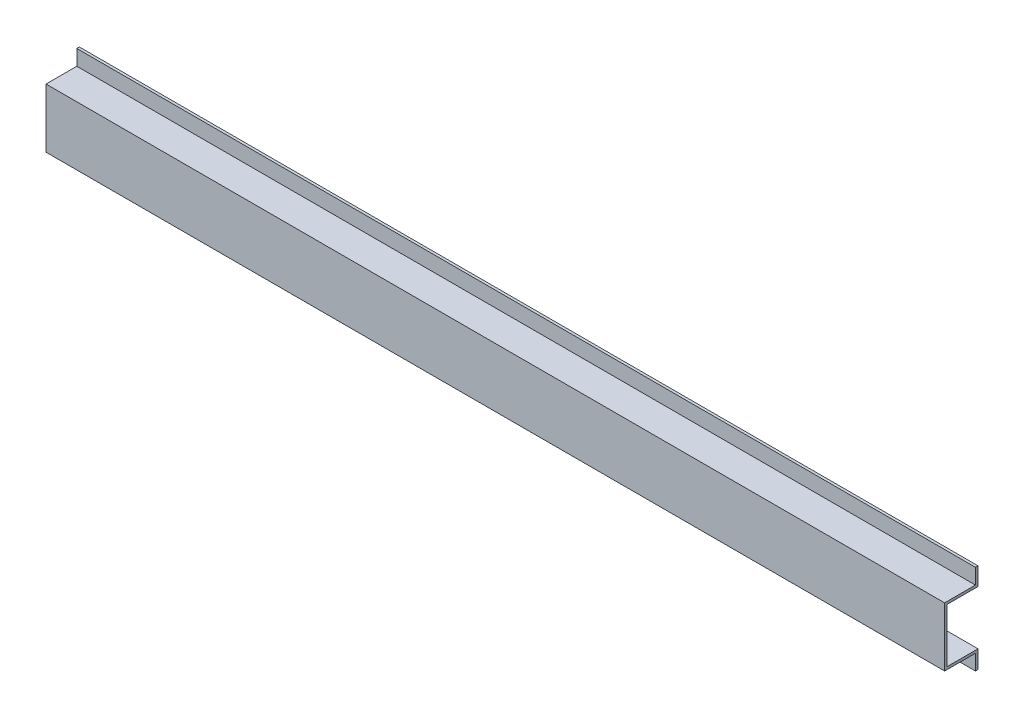
ISO-10303-21;
HEADER;
FILE_DESCRIPTION(('STEP AP214'),'2;1');
FILE_NAME('part.step','',(''),(''),'','','');
FILE_SCHEMA(('AUTOMOTIVE_DESIGN { 1 0 10303 214 1 1 1 1 }'));
ENDSEC;
DATA;
#1=APPLICATION_CONTEXT('core data for automotive mechanical design processes');
#2=APPLICATION_PROTOCOL_DEFINITION('international standard','automotive_design',2000,#1);
#3=PRODUCT_CONTEXT('',#1,'mechanical');
#4=PRODUCT('Part','Part','',(#3));
#5=PRODUCT_RELATED_PRODUCT_CATEGORY('part','',(#4));
#6=PRODUCT_DEFINITION_FORMATION('','',#4);
#7=PRODUCT_DEFINITION_CONTEXT('part definition',#1,'design');
#8=PRODUCT_DEFINITION('design','',#6,#7);
#9=PRODUCT_DEFINITION_SHAPE('','',#8);
#10=(LENGTH_UNIT() NAMED_UNIT(*) SI_UNIT(.MILLI.,.METRE.));
#11=(NAMED_UNIT(*) PLANE_ANGLE_UNIT() SI_UNIT($,.RADIAN.));
#12=(NAMED_UNIT(*) SI_UNIT($,.STERADIAN.) SOLID_ANGLE_UNIT());
#13=UNCERTAINTY_MEASURE_WITH_UNIT(LENGTH_MEASURE(1.E-05),#10,'distance_accuracy_value','');
#14=(GEOMETRIC_REPRESENTATION_CONTEXT(3) GLOBAL_UNCERTAINTY_ASSIGNED_CONTEXT((#13)) GLOBAL_UNIT_ASSIGNED_CONTEXT((#10,
#11,#12)) REPRESENTATION_CONTEXT('',''));
#15=CARTESIAN_POINT('',(0.,0.,0.));
#16=DIRECTION('',(0.,0.,1.));
#17=DIRECTION('',(1.,0.,0.));
#18=AXIS2_PLACEMENT_3D('',#15,#16,#17);
#19=CARTESIAN_POINT('',(350.,0.,0.));
#20=DIRECTION('',(0.,-1.,0.));
#21=DIRECTION('',(0.,0.,-1.));
#22=AXIS2_PLACEMENT_3D('',#19,#20,#21);
#23=PLANE('',#22);
#24=DIRECTION('',(0.,0.,1.));
#25=VECTOR('',#24,1.);
#26=CARTESIAN_POINT('',(0.,0.,0.));
#27=LINE('',#26,#25);
#28=CARTESIAN_POINT('',(0.,0.,0.));
#29=VERTEX_POINT('',#28);
#30=CARTESIAN_POINT('',(0.,0.,1.));
#31=VERTEX_POINT('',#30);
#32=EDGE_CURVE('E153',#29,#31,#27,.T.);
#33=ORIENTED_EDGE('',*,*,#32,.T.);
#34=DIRECTION('',(-1.,0.,0.));
#35=VECTOR('',#34,1.);
#36=CARTESIAN_POINT('',(350.,0.,1.));
#37=LINE('',#36,#35);
#38=CARTESIAN_POINT('',(350.,0.,1.));
#39=VERTEX_POINT('',#38);
#40=EDGE_CURVE('E11',#39,#31,#37,.T.);
#41=ORIENTED_EDGE('',*,*,#40,.F.);
#42=DIRECTION('',(0.,0.,1.));
#43=VECTOR('',#42,1.);
#44=CARTESIAN_POINT('',(350.,0.,0.));
#45=LINE('',#44,#43);
#46=CARTESIAN_POINT('',(350.,0.,0.));
#47=VERTEX_POINT('',#46);
#48=EDGE_CURVE('E175',#47,#39,#45,.T.);
#49=ORIENTED_EDGE('',*,*,#48,.F.);
#50=DIRECTION('',(-1.,0.,0.));
#51=VECTOR('',#50,1.);
#52=CARTESIAN_POINT('',(350.,0.,0.));
#53=LINE('',#52,#51);
#54=EDGE_CURVE('E149',#47,#29,#53,.T.);
#55=ORIENTED_EDGE('',*,*,#54,.T.);
#56=EDGE_LOOP('',(#33,#41,#49,#55));
#57=FACE_BOUND('',#56,.T.);
#58=ADVANCED_FACE('F33',(#57),#23,.F.);
#59=CARTESIAN_POINT('',(350.,0.,1.));
#60=DIRECTION('',(0.,0.,-1.));
#61=DIRECTION('',(0.,1.,0.));
#62=AXIS2_PLACEMENT_3D('',#59,#60,#61);
#63=PLANE('',#62);
#64=DIRECTION('',(0.,-1.,0.));
#65=VECTOR('',#64,1.);
#66=CARTESIAN_POINT('',(0.,0.,1.));
#67=LINE('',#66,#65);
#68=CARTESIAN_POINT('',(0.,-6.,0.999999999999999));
#69=VERTEX_POINT('',#68);
#70=EDGE_CURVE('E156',#31,#69,#67,.T.);
#71=ORIENTED_EDGE('',*,*,#70,.T.);
#72=DIRECTION('',(-1.,0.,0.));
#73=VECTOR('',#72,1.);
#74=CARTESIAN_POINT('',(350.,-6.,0.999999999999999));
#75=LINE('',#74,#73);
#76=CARTESIAN_POINT('',(350.,-6.,0.999999999999999));
#77=VERTEX_POINT('',#76);
#78=EDGE_CURVE('E41',#77,#69,#75,.T.);
#79=ORIENTED_EDGE('',*,*,#78,.F.);
#80=DIRECTION('',(0.,-1.,0.));
#81=VECTOR('',#80,1.);
#82=CARTESIAN_POINT('',(350.,0.,1.));
#83=LINE('',#82,#81);
#84=EDGE_CURVE('E104',#39,#77,#83,.T.);
#85=ORIENTED_EDGE('',*,*,#84,.F.);
#86=ORIENTED_EDGE('',*,*,#40,.T.);
#87=EDGE_LOOP('',(#71,#79,#85,#86));
#88=FACE_BOUND('',#87,.T.);
#89=ADVANCED_FACE('F253',(#88),#63,.F.);
#90=CARTESIAN_POINT('',(350.,-6.,0.999999999999999));
#91=DIRECTION('',(0.,-1.,0.));
#92=DIRECTION('',(0.,0.,-1.));
#93=AXIS2_PLACEMENT_3D('',#90,#91,#92);
#94=PLANE('',#93);
#95=DIRECTION('',(0.,0.,1.));
#96=VECTOR('',#95,1.);
#97=CARTESIAN_POINT('',(0.,-6.,0.999999999999999));
#98=LINE('',#97,#96);
#99=CARTESIAN_POINT('',(0.,-6.,13.));
#100=VERTEX_POINT('',#99);
#101=EDGE_CURVE('E158',#69,#100,#98,.T.);
#102=ORIENTED_EDGE('',*,*,#101,.T.);
#103=DIRECTION('',(-1.,0.,0.));
#104=VECTOR('',#103,1.);
#105=CARTESIAN_POINT('',(350.,-6.,13.));
#106=LINE('',#105,#104);
#107=CARTESIAN_POINT('',(350.,-6.,13.));
#108=VERTEX_POINT('',#107);
#109=EDGE_CURVE('E194',#108,#100,#106,.T.);
#110=ORIENTED_EDGE('',*,*,#109,.F.);
#111=DIRECTION('',(0.,0.,1.));
#112=VECTOR('',#111,1.);
#113=CARTESIAN_POINT('',(350.,-6.,0.999999999999999));
#114=LINE('',#113,#112);
#115=EDGE_CURVE('E202',#77,#108,#114,.T.);
#116=ORIENTED_EDGE('',*,*,#115,.F.);
#117=ORIENTED_EDGE('',*,*,#78,.T.);
#118=EDGE_LOOP('',(#102,#110,#116,#117));
#119=FACE_BOUND('',#118,.T.);
#120=ADVANCED_FACE('F200',(#119),#94,.F.);
#121=CARTESIAN_POINT('',(350.,-6.,13.));
#122=DIRECTION('',(0.,0.,-1.));
#123=DIRECTION('',(0.,1.,0.));
#124=AXIS2_PLACEMENT_3D('',#121,#122,#123);
#125=PLANE('',#124);
#126=DIRECTION('',(0.,-1.,0.));
#127=VECTOR('',#126,1.);
#128=CARTESIAN_POINT('',(0.,-6.,13.));
#129=LINE('',#128,#127);
#130=CARTESIAN_POINT('',(0.,-29.,13.));
#131=VERTEX_POINT('',#130);
#132=EDGE_CURVE('E160',#100,#131,#129,.T.);
#133=ORIENTED_EDGE('',*,*,#132,.T.);
#134=DIRECTION('',(-1.,0.,0.));
#135=VECTOR('',#134,1.);
#136=CARTESIAN_POINT('',(350.,-29.,13.));
#137=LINE('',#136,#135);
#138=CARTESIAN_POINT('',(350.,-29.,13.));
#139=VERTEX_POINT('',#138);
#140=EDGE_CURVE('E191',#139,#131,#137,.T.);
#141=ORIENTED_EDGE('',*,*,#140,.F.);
#142=DIRECTION('',(0.,-1.,0.));
#143=VECTOR('',#142,1.);
#144=CARTESIAN_POINT('',(350.,-6.,13.));
#145=LINE('',#144,#143);
#146=EDGE_CURVE('E220',#108,#139,#145,.T.);
#147=ORIENTED_EDGE('',*,*,#146,.F.);
#148=ORIENTED_EDGE('',*,*,#109,.T.);
#149=EDGE_LOOP('',(#133,#141,#147,#148));
#150=FACE_BOUND('',#149,.T.);
#151=ADVANCED_FACE('F211',(#150),#125,.F.);
#152=CARTESIAN_POINT('',(350.,-29.,13.));
#153=DIRECTION('',(0.,1.,0.));
#154=DIRECTION('',(0.,0.,1.));
#155=AXIS2_PLACEMENT_3D('',#152,#153,#154);
#156=PLANE('',#155);
#157=DIRECTION('',(0.,0.,-1.));
#158=VECTOR('',#157,1.);
#159=CARTESIAN_POINT('',(0.,-29.,13.));
#160=LINE('',#159,#158);
#161=CARTESIAN_POINT('',(0.,-29.,1.));
#162=VERTEX_POINT('',#161);
#163=EDGE_CURVE('E162',#131,#162,#160,.T.);
#164=ORIENTED_EDGE('',*,*,#163,.T.);
#165=DIRECTION('',(-1.,0.,0.));
#166=VECTOR('',#165,1.);
#167=CARTESIAN_POINT('',(350.,-29.,1.));
#168=LINE('',#167,#166);
#169=CARTESIAN_POINT('',(350.,-29.,1.));
#170=VERTEX_POINT('',#169);
#171=EDGE_CURVE('E188',#170,#162,#168,.T.);
#172=ORIENTED_EDGE('',*,*,#171,.F.);
#173=DIRECTION('',(0.,0.,-1.));
#174=VECTOR('',#173,1.);
#175=CARTESIAN_POINT('',(350.,-29.,13.));
#176=LINE('',#175,#174);
#177=EDGE_CURVE('E217',#139,#170,#176,.T.);
#178=ORIENTED_EDGE('',*,*,#177,.F.);
#179=ORIENTED_EDGE('',*,*,#140,.T.);
#180=EDGE_LOOP('',(#164,#172,#178,#179));
#181=FACE_BOUND('',#180,.T.);
#182=ADVANCED_FACE('F215',(#181),#156,.F.);
#183=CARTESIAN_POINT('',(350.,-29.,1.));
#184=DIRECTION('',(0.,0.,-1.));
#185=DIRECTION('',(0.,1.,0.));
#186=AXIS2_PLACEMENT_3D('',#183,#184,#185);
#187=PLANE('',#186);
#188=DIRECTION('',(0.,-1.,0.));
#189=VECTOR('',#188,1.);
#190=CARTESIAN_POINT('',(0.,-29.,1.));
#191=LINE('',#190,#189);
#192=CARTESIAN_POINT('',(0.,-35.,0.999999999999999));
#193=VERTEX_POINT('',#192);
#194=EDGE_CURVE('E164',#162,#193,#191,.T.);
#195=ORIENTED_EDGE('',*,*,#194,.T.);
#196=DIRECTION('',(-1.,0.,0.));
#197=VECTOR('',#196,1.);
#198=CARTESIAN_POINT('',(350.,-35.,0.999999999999999));
#199=LINE('',#198,#197);
#200=CARTESIAN_POINT('',(350.,-35.,0.999999999999999));
#201=VERTEX_POINT('',#200);
#202=EDGE_CURVE('E185',#201,#193,#199,.T.);
#203=ORIENTED_EDGE('',*,*,#202,.F.);
#204=DIRECTION('',(0.,-1.,0.));
#205=VECTOR('',#204,1.);
#206=CARTESIAN_POINT('',(350.,-29.,1.));
#207=LINE('',#206,#205);
#208=EDGE_CURVE('E219',#170,#201,#207,.T.);
#209=ORIENTED_EDGE('',*,*,#208,.F.);
#210=ORIENTED_EDGE('',*,*,#171,.T.);
#211=EDGE_LOOP('',(#195,#203,#209,#210));
#212=FACE_BOUND('',#211,.T.);
#213=ADVANCED_FACE('F266',(#212),#187,.F.);
#214=CARTESIAN_POINT('',(350.,-35.,0.));
#215=DIRECTION('',(0.,1.,0.));
#216=DIRECTION('',(0.,0.,1.));
#217=AXIS2_PLACEMENT_3D('',#214,#215,#216);
#218=PLANE('',#217);
#219=DIRECTION('',(0.,0.,-1.));
#220=VECTOR('',#219,1.);
#221=CARTESIAN_POINT('',(0.,-35.,0.));
#222=LINE('',#221,#220);
#223=CARTESIAN_POINT('',(0.,-35.,0.));
#224=VERTEX_POINT('',#223);
#225=EDGE_CURVE('E166',#193,#224,#222,.T.);
#226=ORIENTED_EDGE('',*,*,#225,.T.);
#227=DIRECTION('',(-1.,0.,0.));
#228=VECTOR('',#227,1.);
#229=CARTESIAN_POINT('',(350.,-35.,0.));
#230=LINE('',#229,#228);
#231=CARTESIAN_POINT('',(350.,-35.,0.));
#232=VERTEX_POINT('',#231);
#233=EDGE_CURVE('E182',#232,#224,#230,.T.);
#234=ORIENTED_EDGE('',*,*,#233,.F.);
#235=DIRECTION('',(0.,0.,-1.));
#236=VECTOR('',#235,1.);
#237=CARTESIAN_POINT('',(350.,-35.,0.));
#238=LINE('',#237,#236);
#239=EDGE_CURVE('E222',#201,#232,#238,.T.);
#240=ORIENTED_EDGE('',*,*,#239,.F.);
#241=ORIENTED_EDGE('',*,*,#202,.T.);
#242=EDGE_LOOP('',(#226,#234,#240,#241));
#243=FACE_BOUND('',#242,.T.);
#244=ADVANCED_FACE('F269',(#243),#218,.F.);
#245=CARTESIAN_POINT('',(350.,-28.,0.));
#246=DIRECTION('',(0.,0.,1.));
#247=DIRECTION('',(0.,-1.,0.));
#248=AXIS2_PLACEMENT_3D('',#245,#246,#247);
#249=PLANE('',#248);
#250=DIRECTION('',(0.,1.,0.));
#251=VECTOR('',#250,1.);
#252=CARTESIAN_POINT('',(0.,-28.,0.));
#253=LINE('',#252,#251);
#254=CARTESIAN_POINT('',(0.,-28.,0.));
#255=VERTEX_POINT('',#254);
#256=EDGE_CURVE('E168',#224,#255,#253,.T.);
#257=ORIENTED_EDGE('',*,*,#256,.T.);
#258=DIRECTION('',(-1.,0.,0.));
#259=VECTOR('',#258,1.);
#260=CARTESIAN_POINT('',(350.,-28.,0.));
#261=LINE('',#260,#259);
#262=CARTESIAN_POINT('',(350.,-28.,0.));
#263=VERTEX_POINT('',#262);
#264=EDGE_CURVE('E179',#263,#255,#261,.T.);
#265=ORIENTED_EDGE('',*,*,#264,.F.);
#266=DIRECTION('',(0.,1.,0.));
#267=VECTOR('',#266,1.);
#268=CARTESIAN_POINT('',(350.,-28.,0.));
#269=LINE('',#268,#267);
#270=EDGE_CURVE('E228',#232,#263,#269,.T.);
#271=ORIENTED_EDGE('',*,*,#270,.F.);
#272=ORIENTED_EDGE('',*,*,#233,.T.);
#273=EDGE_LOOP('',(#257,#265,#271,#272));
#274=FACE_BOUND('',#273,.T.);
#275=ADVANCED_FACE('F234',(#274),#249,.F.);
#276=CARTESIAN_POINT('',(350.,-28.,12.));
#277=DIRECTION('',(0.,-1.,0.));
#278=DIRECTION('',(0.,0.,-1.));
#279=AXIS2_PLACEMENT_3D('',#276,#277,#278);
#280=PLANE('',#279);
#281=DIRECTION('',(0.,0.,1.));
#282=VECTOR('',#281,1.);
#283=CARTESIAN_POINT('',(0.,-28.,12.));
#284=LINE('',#283,#282);
#285=CARTESIAN_POINT('',(0.,-28.,12.));
#286=VERTEX_POINT('',#285);
#287=EDGE_CURVE('E170',#255,#286,#284,.T.);
#288=ORIENTED_EDGE('',*,*,#287,.T.);
#289=DIRECTION('',(-1.,0.,0.));
#290=VECTOR('',#289,1.);
#291=CARTESIAN_POINT('',(350.,-28.,12.));
#292=LINE('',#291,#290);
#293=CARTESIAN_POINT('',(350.,-28.,12.));
#294=VERTEX_POINT('',#293);
#295=EDGE_CURVE('E144',#294,#286,#292,.T.);
#296=ORIENTED_EDGE('',*,*,#295,.F.);
#297=DIRECTION('',(0.,0.,1.));
#298=VECTOR('',#297,1.);
#299=CARTESIAN_POINT('',(350.,-28.,12.));
#300=LINE('',#299,#298);
#301=EDGE_CURVE('E135',#263,#294,#300,.T.);
#302=ORIENTED_EDGE('',*,*,#301,.F.);
#303=ORIENTED_EDGE('',*,*,#264,.T.);
#304=EDGE_LOOP('',(#288,#296,#302,#303));
#305=FACE_BOUND('',#304,.T.);
#306=ADVANCED_FACE('F238',(#305),#280,.F.);
#307=CARTESIAN_POINT('',(350.,-7.,12.));
#308=DIRECTION('',(0.,0.,1.));
#309=DIRECTION('',(0.,-1.,0.));
#310=AXIS2_PLACEMENT_3D('',#307,#308,#309);
#311=PLANE('',#310);
#312=DIRECTION('',(0.,1.,0.));
#313=VECTOR('',#312,1.);
#314=CARTESIAN_POINT('',(0.,-7.,12.));
#315=LINE('',#314,#313);
#316=CARTESIAN_POINT('',(0.,-7.,12.));
#317=VERTEX_POINT('',#316);
#318=EDGE_CURVE('E143',#286,#317,#315,.T.);
#319=ORIENTED_EDGE('',*,*,#318,.T.);
#320=DIRECTION('',(-1.,0.,0.));
#321=VECTOR('',#320,1.);
#322=CARTESIAN_POINT('',(350.,-7.,12.));
#323=LINE('',#322,#321);
#324=CARTESIAN_POINT('',(350.,-7.,12.));
#325=VERTEX_POINT('',#324);
#326=EDGE_CURVE('E140',#325,#317,#323,.T.);
#327=ORIENTED_EDGE('',*,*,#326,.F.);
#328=DIRECTION('',(0.,1.,0.));
#329=VECTOR('',#328,1.);
#330=CARTESIAN_POINT('',(350.,-7.,12.));
#331=LINE('',#330,#329);
#332=EDGE_CURVE('E129',#294,#325,#331,.T.);
#333=ORIENTED_EDGE('',*,*,#332,.F.);
#334=ORIENTED_EDGE('',*,*,#295,.T.);
#335=EDGE_LOOP('',(#319,#327,#333,#334));
#336=FACE_BOUND('',#335,.T.);
#337=ADVANCED_FACE('F141',(#336),#311,.F.);
#338=CARTESIAN_POINT('',(350.,-7.,0.));
#339=DIRECTION('',(0.,1.,0.));
#340=DIRECTION('',(0.,0.,1.));
#341=AXIS2_PLACEMENT_3D('',#338,#339,#340);
#342=PLANE('',#341);
#343=DIRECTION('',(0.,0.,-1.));
#344=VECTOR('',#343,1.);
#345=CARTESIAN_POINT('',(0.,-7.,0.));
#346=LINE('',#345,#344);
#347=CARTESIAN_POINT('',(0.,-7.,0.));
#348=VERTEX_POINT('',#347);
#349=EDGE_CURVE('E90',#317,#348,#346,.T.);
#350=ORIENTED_EDGE('',*,*,#349,.T.);
#351=DIRECTION('',(-1.,0.,0.));
#352=VECTOR('',#351,1.);
#353=CARTESIAN_POINT('',(350.,-7.,0.));
#354=LINE('',#353,#352);
#355=CARTESIAN_POINT('',(350.,-7.,0.));
#356=VERTEX_POINT('',#355);
#357=EDGE_CURVE('E145',#356,#348,#354,.T.);
#358=ORIENTED_EDGE('',*,*,#357,.F.);
#359=DIRECTION('',(0.,0.,-1.));
#360=VECTOR('',#359,1.);
#361=CARTESIAN_POINT('',(350.,-7.,0.));
#362=LINE('',#361,#360);
#363=EDGE_CURVE('E133',#325,#356,#362,.T.);
#364=ORIENTED_EDGE('',*,*,#363,.F.);
#365=ORIENTED_EDGE('',*,*,#326,.T.);
#366=EDGE_LOOP('',(#350,#358,#364,#365));
#367=FACE_BOUND('',#366,.T.);
#368=ADVANCED_FACE('F147',(#367),#342,.F.);
#369=CARTESIAN_POINT('',(350.,0.,0.));
#370=DIRECTION('',(0.,0.,1.));
#371=DIRECTION('',(0.,-1.,0.));
#372=AXIS2_PLACEMENT_3D('',#369,#370,#371);
#373=PLANE('',#372);
#374=DIRECTION('',(0.,1.,0.));
#375=VECTOR('',#374,1.);
#376=CARTESIAN_POINT('',(0.,0.,0.));
#377=LINE('',#376,#375);
#378=EDGE_CURVE('E96',#348,#29,#377,.T.);
#379=ORIENTED_EDGE('',*,*,#378,.T.);
#380=ORIENTED_EDGE('',*,*,#54,.F.);
#381=DIRECTION('',(0.,1.,0.));
#382=VECTOR('',#381,1.);
#383=CARTESIAN_POINT('',(350.,0.,0.));
#384=LINE('',#383,#382);
#385=EDGE_CURVE('E49',#356,#47,#384,.T.);
#386=ORIENTED_EDGE('',*,*,#385,.F.);
#387=ORIENTED_EDGE('',*,*,#357,.T.);
#388=EDGE_LOOP('',(#379,#380,#386,#387));
#389=FACE_BOUND('',#388,.T.);
#390=ADVANCED_FACE('F242',(#389),#373,.F.);
#391=CARTESIAN_POINT('',(350.,0.,0.));
#392=DIRECTION('',(1.,0.,0.));
#393=DIRECTION('',(0.,0.,-1.));
#394=AXIS2_PLACEMENT_3D('',#391,#392,#393);
#395=PLANE('',#394);
#396=ORIENTED_EDGE('',*,*,#48,.T.);
#397=ORIENTED_EDGE('',*,*,#84,.T.);
#398=ORIENTED_EDGE('',*,*,#115,.T.);
#399=ORIENTED_EDGE('',*,*,#146,.T.);
#400=ORIENTED_EDGE('',*,*,#177,.T.);
#401=ORIENTED_EDGE('',*,*,#208,.T.);
#402=ORIENTED_EDGE('',*,*,#239,.T.);
#403=ORIENTED_EDGE('',*,*,#270,.T.);
#404=ORIENTED_EDGE('',*,*,#301,.T.);
#405=ORIENTED_EDGE('',*,*,#332,.T.);
#406=ORIENTED_EDGE('',*,*,#363,.T.);
#407=ORIENTED_EDGE('',*,*,#385,.T.);
#408=EDGE_LOOP('',(#396,#397,#398,#399,#400,#401,#402,#403,#404,#405,#406,#407));
#409=FACE_BOUND('',#408,.T.);
#410=ADVANCED_FACE('F131',(#409),#395,.T.);
#411=CARTESIAN_POINT('',(0.,0.,0.));
#412=DIRECTION('',(1.,0.,0.));
#413=DIRECTION('',(0.,0.,-1.));
#414=AXIS2_PLACEMENT_3D('',#411,#412,#413);
#415=PLANE('',#414);
#416=ORIENTED_EDGE('',*,*,#32,.F.);
#417=ORIENTED_EDGE('',*,*,#378,.F.);
#418=ORIENTED_EDGE('',*,*,#349,.F.);
#419=ORIENTED_EDGE('',*,*,#318,.F.);
#420=ORIENTED_EDGE('',*,*,#287,.F.);
#421=ORIENTED_EDGE('',*,*,#256,.F.);
#422=ORIENTED_EDGE('',*,*,#225,.F.);
#423=ORIENTED_EDGE('',*,*,#194,.F.);
#424=ORIENTED_EDGE('',*,*,#163,.F.);
#425=ORIENTED_EDGE('',*,*,#132,.F.);
#426=ORIENTED_EDGE('',*,*,#101,.F.);
#427=ORIENTED_EDGE('',*,*,#70,.F.);
#428=EDGE_LOOP('',(#416,#417,#418,#419,#420,#421,#422,#423,#424,#425,#426,#427));
#429=FACE_BOUND('',#428,.T.);
#430=ADVANCED_FACE('F206',(#429),#415,.F.);
#431=CLOSED_SHELL('',(#58,#89,#120,#151,#182,#213,#244,#275,#306,#337,#368,#390,#410,#430));
#432=MANIFOLD_SOLID_BREP('B2',#431);
#433=ADVANCED_BREP_SHAPE_REPRESENTATION('',(#18,#432),#14);
#434=SHAPE_DEFINITION_REPRESENTATION(#9,#433);
ENDSEC;
END-ISO-10303-21;
